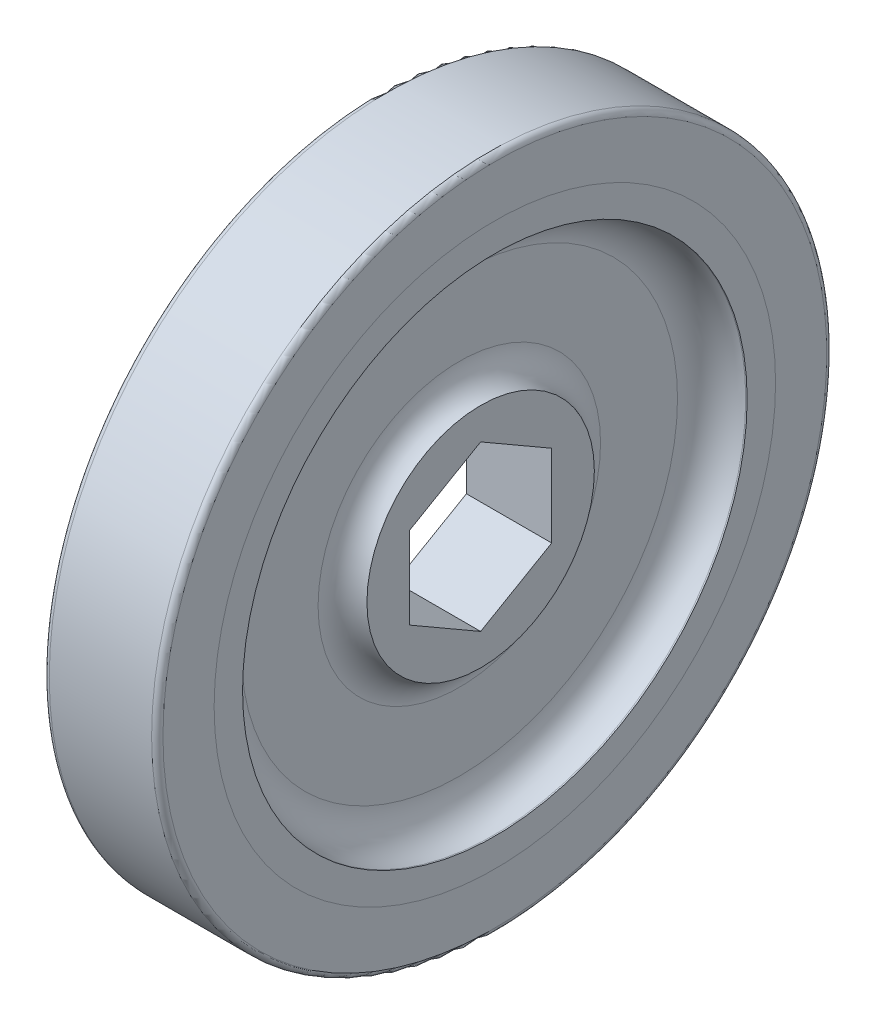
ISO-10303-21;
HEADER;
FILE_DESCRIPTION(('STEP AP214'),'2;1');
FILE_NAME('part.step','',(''),(''),'','','');
FILE_SCHEMA(('AUTOMOTIVE_DESIGN { 1 0 10303 214 1 1 1 1 }'));
ENDSEC;
DATA;
#1=APPLICATION_CONTEXT('core data for automotive mechanical design processes');
#2=APPLICATION_PROTOCOL_DEFINITION('international standard','automotive_design',2000,#1);
#3=PRODUCT_CONTEXT('',#1,'mechanical');
#4=PRODUCT('Part','Part','',(#3));
#5=PRODUCT_RELATED_PRODUCT_CATEGORY('part','',(#4));
#6=PRODUCT_DEFINITION_FORMATION('','',#4);
#7=PRODUCT_DEFINITION_CONTEXT('part definition',#1,'design');
#8=PRODUCT_DEFINITION('design','',#6,#7);
#9=PRODUCT_DEFINITION_SHAPE('','',#8);
#10=(LENGTH_UNIT() NAMED_UNIT(*) SI_UNIT(.MILLI.,.METRE.));
#11=(NAMED_UNIT(*) PLANE_ANGLE_UNIT() SI_UNIT($,.RADIAN.));
#12=(NAMED_UNIT(*) SI_UNIT($,.STERADIAN.) SOLID_ANGLE_UNIT());
#13=UNCERTAINTY_MEASURE_WITH_UNIT(LENGTH_MEASURE(1.E-05),#10,'distance_accuracy_value','');
#14=(GEOMETRIC_REPRESENTATION_CONTEXT(3) GLOBAL_UNCERTAINTY_ASSIGNED_CONTEXT((#13)) GLOBAL_UNIT_ASSIGNED_CONTEXT((#10,
#11,#12)) REPRESENTATION_CONTEXT('',''));
#15=CARTESIAN_POINT('',(0.,0.,0.));
#16=DIRECTION('',(0.,0.,1.));
#17=DIRECTION('',(1.,0.,0.));
#18=AXIS2_PLACEMENT_3D('',#15,#16,#17);
#19=CARTESIAN_POINT('',(-5.08,30.1625,0.));
#20=DIRECTION('',(1.,0.,0.));
#21=DIRECTION('',(0.,0.,-1.));
#22=AXIS2_PLACEMENT_3D('',#19,#20,#21);
#23=PLANE('',#22);
#24=CARTESIAN_POINT('',(-5.08,0.,0.));
#25=DIRECTION('',(1.,0.,0.));
#26=DIRECTION('',(0.,0.,-1.));
#27=AXIS2_PLACEMENT_3D('',#24,#25,#26);
#28=CIRCLE('',#27,29.6545);
#29=CARTESIAN_POINT('',(-5.08,0.,-29.6545));
#30=VERTEX_POINT('',#29);
#31=EDGE_CURVE('E57',#30,#30,#28,.F.);
#32=ORIENTED_EDGE('',*,*,#31,.T.);
#33=EDGE_LOOP('',(#32));
#34=FACE_BOUND('',#33,.T.);
#35=CARTESIAN_POINT('',(-5.08,0.,0.));
#36=DIRECTION('',(-1.,0.,0.));
#37=DIRECTION('',(0.,0.,1.));
#38=AXIS2_PLACEMENT_3D('',#35,#36,#37);
#39=CIRCLE('',#38,25.0825);
#40=CARTESIAN_POINT('',(-5.08,0.,25.0825));
#41=VERTEX_POINT('',#40);
#42=EDGE_CURVE('E62',#41,#41,#39,.T.);
#43=ORIENTED_EDGE('',*,*,#42,.F.);
#44=EDGE_LOOP('',(#43));
#45=FACE_BOUND('',#44,.T.);
#46=ADVANCED_FACE('F42',(#34,#45),#23,.F.);
#47=CARTESIAN_POINT('',(-3.81,0.,0.));
#48=DIRECTION('',(-1.,0.,0.));
#49=DIRECTION('',(0.,0.,1.));
#50=AXIS2_PLACEMENT_3D('',#47,#48,#49);
#51=CYLINDRICAL_SURFACE('',#50,25.0825);
#52=CARTESIAN_POINT('',(-2.54,0.,0.));
#53=DIRECTION('',(-1.,0.,0.));
#54=DIRECTION('',(0.,0.,1.));
#55=AXIS2_PLACEMENT_3D('',#52,#53,#54);
#56=CIRCLE('',#55,25.0825);
#57=CARTESIAN_POINT('',(-2.54,0.,25.0825));
#58=VERTEX_POINT('',#57);
#59=EDGE_CURVE('E65',#58,#58,#56,.T.);
#60=ORIENTED_EDGE('',*,*,#59,.F.);
#61=EDGE_LOOP('',(#60));
#62=FACE_BOUND('',#61,.T.);
#63=ORIENTED_EDGE('',*,*,#42,.T.);
#64=EDGE_LOOP('',(#63));
#65=FACE_BOUND('',#64,.T.);
#66=ADVANCED_FACE('F104',(#62,#65),#51,.F.);
#67=CARTESIAN_POINT('',(-2.54,25.0825,0.));
#68=DIRECTION('',(-1.,0.,0.));
#69=DIRECTION('',(0.,0.,1.));
#70=AXIS2_PLACEMENT_3D('',#67,#68,#69);
#71=PLANE('',#70);
#72=CARTESIAN_POINT('',(-2.54,0.,0.));
#73=DIRECTION('',(-1.,0.,0.));
#74=DIRECTION('',(0.,0.,1.));
#75=AXIS2_PLACEMENT_3D('',#72,#73,#74);
#76=CIRCLE('',#75,27.6225);
#77=CARTESIAN_POINT('',(-2.54,0.,27.6225));
#78=VERTEX_POINT('',#77);
#79=EDGE_CURVE('E68',#78,#78,#76,.T.);
#80=ORIENTED_EDGE('',*,*,#79,.F.);
#81=EDGE_LOOP('',(#80));
#82=FACE_BOUND('',#81,.T.);
#83=ORIENTED_EDGE('',*,*,#59,.T.);
#84=EDGE_LOOP('',(#83));
#85=FACE_BOUND('',#84,.T.);
#86=ADVANCED_FACE('F98',(#82,#85),#71,.F.);
#87=CARTESIAN_POINT('',(-3.81,0.,0.));
#88=DIRECTION('',(-1.,0.,0.));
#89=DIRECTION('',(0.,0.,1.));
#90=AXIS2_PLACEMENT_3D('',#87,#88,#89);
#91=CYLINDRICAL_SURFACE('',#90,27.6225);
#92=CARTESIAN_POINT('',(2.54,0.,0.));
#93=DIRECTION('',(-1.,0.,0.));
#94=DIRECTION('',(0.,0.,1.));
#95=AXIS2_PLACEMENT_3D('',#92,#93,#94);
#96=CIRCLE('',#95,27.6225);
#97=CARTESIAN_POINT('',(2.54,0.,27.6225));
#98=VERTEX_POINT('',#97);
#99=EDGE_CURVE('E71',#98,#98,#96,.T.);
#100=ORIENTED_EDGE('',*,*,#99,.F.);
#101=EDGE_LOOP('',(#100));
#102=FACE_BOUND('',#101,.T.);
#103=ORIENTED_EDGE('',*,*,#79,.T.);
#104=EDGE_LOOP('',(#103));
#105=FACE_BOUND('',#104,.T.);
#106=ADVANCED_FACE('F92',(#102,#105),#91,.F.);
#107=CARTESIAN_POINT('',(2.54,27.6225,0.));
#108=DIRECTION('',(1.,0.,0.));
#109=DIRECTION('',(0.,0.,-1.));
#110=AXIS2_PLACEMENT_3D('',#107,#108,#109);
#111=PLANE('',#110);
#112=CARTESIAN_POINT('',(2.54,0.,0.));
#113=DIRECTION('',(-1.,0.,0.));
#114=DIRECTION('',(0.,0.,1.));
#115=AXIS2_PLACEMENT_3D('',#112,#113,#114);
#116=CIRCLE('',#115,25.0825);
#117=CARTESIAN_POINT('',(2.54,0.,25.0825));
#118=VERTEX_POINT('',#117);
#119=EDGE_CURVE('E74',#118,#118,#116,.T.);
#120=ORIENTED_EDGE('',*,*,#119,.F.);
#121=EDGE_LOOP('',(#120));
#122=FACE_BOUND('',#121,.T.);
#123=ORIENTED_EDGE('',*,*,#99,.T.);
#124=EDGE_LOOP('',(#123));
#125=FACE_BOUND('',#124,.T.);
#126=ADVANCED_FACE('F86',(#122,#125),#111,.F.);
#127=CARTESIAN_POINT('',(-3.81,0.,0.));
#128=DIRECTION('',(-1.,0.,0.));
#129=DIRECTION('',(0.,0.,1.));
#130=AXIS2_PLACEMENT_3D('',#127,#128,#129);
#131=CYLINDRICAL_SURFACE('',#130,25.0825);
#132=CARTESIAN_POINT('',(5.08,0.,0.));
#133=DIRECTION('',(-1.,0.,0.));
#134=DIRECTION('',(0.,0.,1.));
#135=AXIS2_PLACEMENT_3D('',#132,#133,#134);
#136=CIRCLE('',#135,25.0825);
#137=CARTESIAN_POINT('',(5.08,0.,25.0825));
#138=VERTEX_POINT('',#137);
#139=EDGE_CURVE('E77',#138,#138,#136,.T.);
#140=ORIENTED_EDGE('',*,*,#139,.F.);
#141=EDGE_LOOP('',(#140));
#142=FACE_BOUND('',#141,.T.);
#143=ORIENTED_EDGE('',*,*,#119,.T.);
#144=EDGE_LOOP('',(#143));
#145=FACE_BOUND('',#144,.T.);
#146=ADVANCED_FACE('F83',(#142,#145),#131,.F.);
#147=CARTESIAN_POINT('',(5.08,25.0825,0.));
#148=DIRECTION('',(-1.,0.,0.));
#149=DIRECTION('',(0.,0.,1.));
#150=AXIS2_PLACEMENT_3D('',#147,#148,#149);
#151=PLANE('',#150);
#152=CARTESIAN_POINT('',(5.08,0.,0.));
#153=DIRECTION('',(-1.,0.,0.));
#154=DIRECTION('',(0.,0.,1.));
#155=AXIS2_PLACEMENT_3D('',#152,#153,#154);
#156=CIRCLE('',#155,29.6545);
#157=CARTESIAN_POINT('',(5.08,0.,29.6545));
#158=VERTEX_POINT('',#157);
#159=EDGE_CURVE('E11',#158,#158,#156,.F.);
#160=ORIENTED_EDGE('',*,*,#159,.T.);
#161=EDGE_LOOP('',(#160));
#162=FACE_BOUND('',#161,.T.);
#163=ORIENTED_EDGE('',*,*,#139,.T.);
#164=EDGE_LOOP('',(#163));
#165=FACE_BOUND('',#164,.T.);
#166=ADVANCED_FACE('F81',(#162,#165),#151,.F.);
#167=CARTESIAN_POINT('',(-3.81,0.,0.));
#168=DIRECTION('',(-1.,0.,0.));
#169=DIRECTION('',(0.,0.,1.));
#170=AXIS2_PLACEMENT_3D('',#167,#168,#169);
#171=CYLINDRICAL_SURFACE('',#170,30.1625);
#172=CARTESIAN_POINT('',(-4.572,0.,0.));
#173=DIRECTION('',(1.,0.,0.));
#174=DIRECTION('',(0.,0.,-1.));
#175=AXIS2_PLACEMENT_3D('',#172,#173,#174);
#176=CIRCLE('',#175,30.1625);
#177=CARTESIAN_POINT('',(-4.572,0.,-30.1625));
#178=VERTEX_POINT('',#177);
#179=EDGE_CURVE('E49',#178,#178,#176,.T.);
#180=ORIENTED_EDGE('',*,*,#179,.T.);
#181=EDGE_LOOP('',(#180));
#182=FACE_BOUND('',#181,.T.);
#183=CARTESIAN_POINT('',(4.572,0.,0.));
#184=DIRECTION('',(-1.,0.,0.));
#185=DIRECTION('',(0.,0.,1.));
#186=AXIS2_PLACEMENT_3D('',#183,#184,#185);
#187=CIRCLE('',#186,30.1625);
#188=CARTESIAN_POINT('',(4.572,0.,30.1625));
#189=VERTEX_POINT('',#188);
#190=EDGE_CURVE('E53',#189,#189,#187,.T.);
#191=ORIENTED_EDGE('',*,*,#190,.T.);
#192=EDGE_LOOP('',(#191));
#193=FACE_BOUND('',#192,.T.);
#194=ADVANCED_FACE('F120',(#182,#193),#171,.T.);
#195=CARTESIAN_POINT('',(-4.572,0.,0.));
#196=DIRECTION('',(1.,0.,0.));
#197=DIRECTION('',(0.,0.,-1.));
#198=AXIS2_PLACEMENT_3D('',#195,#196,#197);
#199=TOROIDAL_SURFACE('',#198,29.6545,0.508);
#200=ORIENTED_EDGE('',*,*,#179,.F.);
#201=EDGE_LOOP('',(#200));
#202=FACE_BOUND('',#201,.T.);
#203=ORIENTED_EDGE('',*,*,#31,.F.);
#204=EDGE_LOOP('',(#203));
#205=FACE_BOUND('',#204,.T.);
#206=ADVANCED_FACE('F118',(#202,#205),#199,.T.);
#207=CARTESIAN_POINT('',(4.572,0.,0.));
#208=DIRECTION('',(-1.,0.,0.));
#209=DIRECTION('',(0.,0.,1.));
#210=AXIS2_PLACEMENT_3D('',#207,#208,#209);
#211=TOROIDAL_SURFACE('',#210,29.6545,0.508);
#212=ORIENTED_EDGE('',*,*,#159,.F.);
#213=EDGE_LOOP('',(#212));
#214=FACE_BOUND('',#213,.T.);
#215=ORIENTED_EDGE('',*,*,#190,.F.);
#216=EDGE_LOOP('',(#215));
#217=FACE_BOUND('',#216,.T.);
#218=ADVANCED_FACE('F44',(#214,#217),#211,.T.);
#219=CLOSED_SHELL('',(#46,#66,#86,#106,#126,#146,#166,#194,#206,#218));
#220=MANIFOLD_SOLID_BREP('B2',#219);
#221=CARTESIAN_POINT('',(-3.81,10.16,0.));
#222=DIRECTION('',(1.,0.,0.));
#223=DIRECTION('',(0.,0.,-1.));
#224=AXIS2_PLACEMENT_3D('',#221,#222,#223);
#225=PLANE('',#224);
#226=DIRECTION('',(0.,1.,0.));
#227=VECTOR('',#226,1.);
#228=CARTESIAN_POINT('',(-3.81,10.16,-6.35));
#229=LINE('',#228,#227);
#230=CARTESIAN_POINT('',(-3.81,-3.66617420935412,-6.35));
#231=VERTEX_POINT('',#230);
#232=CARTESIAN_POINT('',(-3.81,3.66617420935413,-6.35));
#233=VERTEX_POINT('',#232);
#234=EDGE_CURVE('E300',#231,#233,#229,.T.);
#235=ORIENTED_EDGE('',*,*,#234,.T.);
#236=DIRECTION('',(0.,0.5,0.866025403784439));
#237=VECTOR('',#236,1.);
#238=CARTESIAN_POINT('',(-3.81,8.03926131403119,1.22440905122495));
#239=LINE('',#238,#237);
#240=CARTESIAN_POINT('',(-3.81,7.33234841870825,0.));
#241=VERTEX_POINT('',#240);
#242=EDGE_CURVE('E282',#233,#241,#239,.T.);
#243=ORIENTED_EDGE('',*,*,#242,.T.);
#244=DIRECTION('',(0.,-0.5,0.866025403784439));
#245=VECTOR('',#244,1.);
#246=CARTESIAN_POINT('',(-3.81,8.03926131403119,-1.22440905122495));
#247=LINE('',#246,#245);
#248=CARTESIAN_POINT('',(-3.81,3.66617420935413,6.35));
#249=VERTEX_POINT('',#248);
#250=EDGE_CURVE('E283',#241,#249,#247,.T.);
#251=ORIENTED_EDGE('',*,*,#250,.T.);
#252=DIRECTION('',(0.,-1.,0.));
#253=VECTOR('',#252,1.);
#254=CARTESIAN_POINT('',(-3.81,10.16,6.35));
#255=LINE('',#254,#253);
#256=CARTESIAN_POINT('',(-3.81,-3.66617420935412,6.35));
#257=VERTEX_POINT('',#256);
#258=EDGE_CURVE('E255',#249,#257,#255,.T.);
#259=ORIENTED_EDGE('',*,*,#258,.T.);
#260=DIRECTION('',(0.,-0.5,-0.866025403784439));
#261=VECTOR('',#260,1.);
#262=CARTESIAN_POINT('',(-3.81,-2.95926131403118,7.57440905122495));
#263=LINE('',#262,#261);
#264=CARTESIAN_POINT('',(-3.81,-7.33234841870825,0.));
#265=VERTEX_POINT('',#264);
#266=EDGE_CURVE('E294',#257,#265,#263,.T.);
#267=ORIENTED_EDGE('',*,*,#266,.T.);
#268=DIRECTION('',(0.,0.5,-0.866025403784439));
#269=VECTOR('',#268,1.);
#270=CARTESIAN_POINT('',(-3.81,-2.95926131403119,-7.57440905122495));
#271=LINE('',#270,#269);
#272=EDGE_CURVE('E297',#265,#231,#271,.T.);
#273=ORIENTED_EDGE('',*,*,#272,.T.);
#274=EDGE_LOOP('',(#235,#243,#251,#259,#267,#273));
#275=FACE_BOUND('',#274,.T.);
#276=CARTESIAN_POINT('',(-3.81,0.,0.));
#277=DIRECTION('',(-1.,0.,0.));
#278=DIRECTION('',(0.,0.,1.));
#279=AXIS2_PLACEMENT_3D('',#276,#277,#278);
#280=CIRCLE('',#279,10.16);
#281=CARTESIAN_POINT('',(-3.81,0.,10.16));
#282=VERTEX_POINT('',#281);
#283=EDGE_CURVE('E330',#282,#282,#280,.T.);
#284=ORIENTED_EDGE('',*,*,#283,.T.);
#285=EDGE_LOOP('',(#284));
#286=FACE_BOUND('',#285,.T.);
#287=ADVANCED_FACE('F193',(#275,#286),#225,.F.);
#288=CARTESIAN_POINT('',(3.81,10.16,0.));
#289=DIRECTION('',(-1.,0.,0.));
#290=DIRECTION('',(0.,0.,1.));
#291=AXIS2_PLACEMENT_3D('',#288,#289,#290);
#292=PLANE('',#291);
#293=DIRECTION('',(0.,0.5,-0.866025403784439));
#294=VECTOR('',#293,1.);
#295=CARTESIAN_POINT('',(3.81,8.03926131403119,-1.22440905122495));
#296=LINE('',#295,#294);
#297=CARTESIAN_POINT('',(3.81,3.66617420935413,6.35));
#298=VERTEX_POINT('',#297);
#299=CARTESIAN_POINT('',(3.81,7.33234841870825,0.));
#300=VERTEX_POINT('',#299);
#301=EDGE_CURVE('E243',#298,#300,#296,.T.);
#302=ORIENTED_EDGE('',*,*,#301,.T.);
#303=DIRECTION('',(0.,-0.5,-0.866025403784439));
#304=VECTOR('',#303,1.);
#305=CARTESIAN_POINT('',(3.81,8.03926131403119,1.22440905122495));
#306=LINE('',#305,#304);
#307=CARTESIAN_POINT('',(3.81,3.66617420935413,-6.35));
#308=VERTEX_POINT('',#307);
#309=EDGE_CURVE('E40',#300,#308,#306,.T.);
#310=ORIENTED_EDGE('',*,*,#309,.T.);
#311=DIRECTION('',(0.,-1.,0.));
#312=VECTOR('',#311,1.);
#313=CARTESIAN_POINT('',(3.81,10.16,-6.35));
#314=LINE('',#313,#312);
#315=CARTESIAN_POINT('',(3.81,-3.66617420935412,-6.35));
#316=VERTEX_POINT('',#315);
#317=EDGE_CURVE('E201',#308,#316,#314,.T.);
#318=ORIENTED_EDGE('',*,*,#317,.T.);
#319=DIRECTION('',(0.,-0.5,0.866025403784439));
#320=VECTOR('',#319,1.);
#321=CARTESIAN_POINT('',(3.81,-2.95926131403119,-7.57440905122495));
#322=LINE('',#321,#320);
#323=CARTESIAN_POINT('',(3.81,-7.33234841870825,0.));
#324=VERTEX_POINT('',#323);
#325=EDGE_CURVE('E265',#316,#324,#322,.T.);
#326=ORIENTED_EDGE('',*,*,#325,.T.);
#327=DIRECTION('',(0.,0.5,0.866025403784439));
#328=VECTOR('',#327,1.);
#329=CARTESIAN_POINT('',(3.81,-2.95926131403118,7.57440905122495));
#330=LINE('',#329,#328);
#331=CARTESIAN_POINT('',(3.81,-3.66617420935412,6.35));
#332=VERTEX_POINT('',#331);
#333=EDGE_CURVE('E263',#324,#332,#330,.T.);
#334=ORIENTED_EDGE('',*,*,#333,.T.);
#335=DIRECTION('',(0.,1.,0.));
#336=VECTOR('',#335,1.);
#337=CARTESIAN_POINT('',(3.81,10.16,6.35));
#338=LINE('',#337,#336);
#339=EDGE_CURVE('E247',#332,#298,#338,.T.);
#340=ORIENTED_EDGE('',*,*,#339,.T.);
#341=EDGE_LOOP('',(#302,#310,#318,#326,#334,#340));
#342=FACE_BOUND('',#341,.T.);
#343=CARTESIAN_POINT('',(3.81,0.,0.));
#344=DIRECTION('',(-1.,0.,0.));
#345=DIRECTION('',(0.,0.,1.));
#346=AXIS2_PLACEMENT_3D('',#343,#344,#345);
#347=CIRCLE('',#346,10.16);
#348=CARTESIAN_POINT('',(3.81,0.,10.16));
#349=VERTEX_POINT('',#348);
#350=EDGE_CURVE('E327',#349,#349,#347,.T.);
#351=ORIENTED_EDGE('',*,*,#350,.F.);
#352=EDGE_LOOP('',(#351));
#353=FACE_BOUND('',#352,.T.);
#354=ADVANCED_FACE('F260',(#342,#353),#292,.F.);
#355=CARTESIAN_POINT('',(1.905,22.5425,0.));
#356=DIRECTION('',(-1.,0.,0.));
#357=DIRECTION('',(0.,0.,1.));
#358=AXIS2_PLACEMENT_3D('',#355,#356,#357);
#359=PLANE('',#358);
#360=CARTESIAN_POINT('',(1.905,0.,0.));
#361=DIRECTION('',(-1.,0.,0.));
#362=DIRECTION('',(0.,0.,1.));
#363=AXIS2_PLACEMENT_3D('',#360,#361,#362);
#364=CIRCLE('',#363,19.4945);
#365=CARTESIAN_POINT('',(1.905,0.,19.4945));
#366=VERTEX_POINT('',#365);
#367=EDGE_CURVE('E342',#366,#366,#364,.F.);
#368=ORIENTED_EDGE('',*,*,#367,.T.);
#369=EDGE_LOOP('',(#368));
#370=FACE_BOUND('',#369,.T.);
#371=CARTESIAN_POINT('',(1.905,0.,0.));
#372=DIRECTION('',(-1.,0.,0.));
#373=DIRECTION('',(0.,0.,1.));
#374=AXIS2_PLACEMENT_3D('',#371,#372,#373);
#375=CIRCLE('',#374,12.6193444248417);
#376=CARTESIAN_POINT('',(1.905,0.,12.6193444248417));
#377=VERTEX_POINT('',#376);
#378=EDGE_CURVE('E336',#377,#377,#375,.T.);
#379=ORIENTED_EDGE('',*,*,#378,.T.);
#380=EDGE_LOOP('',(#379));
#381=FACE_BOUND('',#380,.T.);
#382=ADVANCED_FACE('F377',(#370,#381),#359,.F.);
#383=CARTESIAN_POINT('',(-3.81,0.,0.));
#384=DIRECTION('',(-1.,0.,0.));
#385=DIRECTION('',(0.,0.,1.));
#386=AXIS2_PLACEMENT_3D('',#383,#384,#385);
#387=CYLINDRICAL_SURFACE('',#386,22.5425);
#388=CARTESIAN_POINT('',(4.953,0.,0.));
#389=DIRECTION('',(-1.,0.,0.));
#390=DIRECTION('',(0.,0.,1.));
#391=AXIS2_PLACEMENT_3D('',#388,#389,#390);
#392=CIRCLE('',#391,22.5425);
#393=CARTESIAN_POINT('',(4.953,0.,22.5425));
#394=VERTEX_POINT('',#393);
#395=EDGE_CURVE('E339',#394,#394,#392,.T.);
#396=ORIENTED_EDGE('',*,*,#395,.T.);
#397=EDGE_LOOP('',(#396));
#398=FACE_BOUND('',#397,.T.);
#399=CARTESIAN_POINT('',(5.08,0.,0.));
#400=DIRECTION('',(-1.,0.,0.));
#401=DIRECTION('',(0.,0.,1.));
#402=AXIS2_PLACEMENT_3D('',#399,#400,#401);
#403=CIRCLE('',#402,22.5425);
#404=CARTESIAN_POINT('',(5.08,0.,22.5425));
#405=VERTEX_POINT('',#404);
#406=EDGE_CURVE('E324',#405,#405,#403,.T.);
#407=ORIENTED_EDGE('',*,*,#406,.F.);
#408=EDGE_LOOP('',(#407));
#409=FACE_BOUND('',#408,.T.);
#410=ADVANCED_FACE('F391',(#398,#409),#387,.F.);
#411=CARTESIAN_POINT('',(5.08,25.0825,0.));
#412=DIRECTION('',(-1.,0.,0.));
#413=DIRECTION('',(0.,0.,1.));
#414=AXIS2_PLACEMENT_3D('',#411,#412,#413);
#415=PLANE('',#414);
#416=CARTESIAN_POINT('',(5.08,0.,0.));
#417=DIRECTION('',(-1.,0.,0.));
#418=DIRECTION('',(0.,0.,1.));
#419=AXIS2_PLACEMENT_3D('',#416,#417,#418);
#420=CIRCLE('',#419,25.0825);
#421=CARTESIAN_POINT('',(5.08,0.,25.0825));
#422=VERTEX_POINT('',#421);
#423=EDGE_CURVE('E321',#422,#422,#420,.T.);
#424=ORIENTED_EDGE('',*,*,#423,.F.);
#425=EDGE_LOOP('',(#424));
#426=FACE_BOUND('',#425,.T.);
#427=ORIENTED_EDGE('',*,*,#406,.T.);
#428=EDGE_LOOP('',(#427));
#429=FACE_BOUND('',#428,.T.);
#430=ADVANCED_FACE('F394',(#426,#429),#415,.F.);
#431=CARTESIAN_POINT('',(-3.81,0.,0.));
#432=DIRECTION('',(-1.,0.,0.));
#433=DIRECTION('',(0.,0.,1.));
#434=AXIS2_PLACEMENT_3D('',#431,#432,#433);
#435=CYLINDRICAL_SURFACE('',#434,25.0825);
#436=CARTESIAN_POINT('',(2.54,0.,0.));
#437=DIRECTION('',(-1.,0.,0.));
#438=DIRECTION('',(0.,0.,1.));
#439=AXIS2_PLACEMENT_3D('',#436,#437,#438);
#440=CIRCLE('',#439,25.0825);
#441=CARTESIAN_POINT('',(2.54,0.,25.0825));
#442=VERTEX_POINT('',#441);
#443=EDGE_CURVE('E318',#442,#442,#440,.T.);
#444=ORIENTED_EDGE('',*,*,#443,.F.);
#445=EDGE_LOOP('',(#444));
#446=FACE_BOUND('',#445,.T.);
#447=ORIENTED_EDGE('',*,*,#423,.T.);
#448=EDGE_LOOP('',(#447));
#449=FACE_BOUND('',#448,.T.);
#450=ADVANCED_FACE('F399',(#446,#449),#435,.T.);
#451=CARTESIAN_POINT('',(2.54,27.6225,0.));
#452=DIRECTION('',(-1.,0.,0.));
#453=DIRECTION('',(0.,0.,1.));
#454=AXIS2_PLACEMENT_3D('',#451,#452,#453);
#455=PLANE('',#454);
#456=CARTESIAN_POINT('',(2.54,0.,0.));
#457=DIRECTION('',(-1.,0.,0.));
#458=DIRECTION('',(0.,0.,1.));
#459=AXIS2_PLACEMENT_3D('',#456,#457,#458);
#460=CIRCLE('',#459,27.6225);
#461=CARTESIAN_POINT('',(2.54,0.,27.6225));
#462=VERTEX_POINT('',#461);
#463=EDGE_CURVE('E315',#462,#462,#460,.T.);
#464=ORIENTED_EDGE('',*,*,#463,.F.);
#465=EDGE_LOOP('',(#464));
#466=FACE_BOUND('',#465,.T.);
#467=ORIENTED_EDGE('',*,*,#443,.T.);
#468=EDGE_LOOP('',(#467));
#469=FACE_BOUND('',#468,.T.);
#470=ADVANCED_FACE('F405',(#466,#469),#455,.F.);
#471=CARTESIAN_POINT('',(-3.81,0.,0.));
#472=DIRECTION('',(-1.,0.,0.));
#473=DIRECTION('',(0.,0.,1.));
#474=AXIS2_PLACEMENT_3D('',#471,#472,#473);
#475=CYLINDRICAL_SURFACE('',#474,27.6225);
#476=CARTESIAN_POINT('',(-2.54,0.,0.));
#477=DIRECTION('',(-1.,0.,0.));
#478=DIRECTION('',(0.,0.,1.));
#479=AXIS2_PLACEMENT_3D('',#476,#477,#478);
#480=CIRCLE('',#479,27.6225);
#481=CARTESIAN_POINT('',(-2.54,0.,27.6225));
#482=VERTEX_POINT('',#481);
#483=EDGE_CURVE('E312',#482,#482,#480,.T.);
#484=ORIENTED_EDGE('',*,*,#483,.F.);
#485=EDGE_LOOP('',(#484));
#486=FACE_BOUND('',#485,.T.);
#487=ORIENTED_EDGE('',*,*,#463,.T.);
#488=EDGE_LOOP('',(#487));
#489=FACE_BOUND('',#488,.T.);
#490=ADVANCED_FACE('F528',(#486,#489),#475,.T.);
#491=CARTESIAN_POINT('',(-2.54,27.6225,0.));
#492=DIRECTION('',(1.,0.,0.));
#493=DIRECTION('',(0.,0.,-1.));
#494=AXIS2_PLACEMENT_3D('',#491,#492,#493);
#495=PLANE('',#494);
#496=CARTESIAN_POINT('',(-2.54,0.,0.));
#497=DIRECTION('',(-1.,0.,0.));
#498=DIRECTION('',(0.,0.,1.));
#499=AXIS2_PLACEMENT_3D('',#496,#497,#498);
#500=CIRCLE('',#499,25.0825);
#501=CARTESIAN_POINT('',(-2.54,0.,25.0825));
#502=VERTEX_POINT('',#501);
#503=EDGE_CURVE('E309',#502,#502,#500,.T.);
#504=ORIENTED_EDGE('',*,*,#503,.F.);
#505=EDGE_LOOP('',(#504));
#506=FACE_BOUND('',#505,.T.);
#507=ORIENTED_EDGE('',*,*,#483,.T.);
#508=EDGE_LOOP('',(#507));
#509=FACE_BOUND('',#508,.T.);
#510=ADVANCED_FACE('F524',(#506,#509),#495,.F.);
#511=CARTESIAN_POINT('',(-3.81,0.,0.));
#512=DIRECTION('',(-1.,0.,0.));
#513=DIRECTION('',(0.,0.,1.));
#514=AXIS2_PLACEMENT_3D('',#511,#512,#513);
#515=CYLINDRICAL_SURFACE('',#514,25.0825);
#516=CARTESIAN_POINT('',(-5.08,0.,0.));
#517=DIRECTION('',(-1.,0.,0.));
#518=DIRECTION('',(0.,0.,1.));
#519=AXIS2_PLACEMENT_3D('',#516,#517,#518);
#520=CIRCLE('',#519,25.0825);
#521=CARTESIAN_POINT('',(-5.08,0.,25.0825));
#522=VERTEX_POINT('',#521);
#523=EDGE_CURVE('E306',#522,#522,#520,.T.);
#524=ORIENTED_EDGE('',*,*,#523,.F.);
#525=EDGE_LOOP('',(#524));
#526=FACE_BOUND('',#525,.T.);
#527=ORIENTED_EDGE('',*,*,#503,.T.);
#528=EDGE_LOOP('',(#527));
#529=FACE_BOUND('',#528,.T.);
#530=ADVANCED_FACE('F520',(#526,#529),#515,.T.);
#531=CARTESIAN_POINT('',(-5.08,25.0825,0.));
#532=DIRECTION('',(1.,0.,0.));
#533=DIRECTION('',(0.,0.,-1.));
#534=AXIS2_PLACEMENT_3D('',#531,#532,#533);
#535=PLANE('',#534);
#536=CARTESIAN_POINT('',(-5.08,0.,0.));
#537=DIRECTION('',(-1.,0.,0.));
#538=DIRECTION('',(0.,0.,1.));
#539=AXIS2_PLACEMENT_3D('',#536,#537,#538);
#540=CIRCLE('',#539,22.5425);
#541=CARTESIAN_POINT('',(-5.08,0.,22.5425));
#542=VERTEX_POINT('',#541);
#543=EDGE_CURVE('E303',#542,#542,#540,.T.);
#544=ORIENTED_EDGE('',*,*,#543,.F.);
#545=EDGE_LOOP('',(#544));
#546=FACE_BOUND('',#545,.T.);
#547=ORIENTED_EDGE('',*,*,#523,.T.);
#548=EDGE_LOOP('',(#547));
#549=FACE_BOUND('',#548,.T.);
#550=ADVANCED_FACE('F434',(#546,#549),#535,.F.);
#551=CARTESIAN_POINT('',(-3.81,0.,0.));
#552=DIRECTION('',(-1.,0.,0.));
#553=DIRECTION('',(0.,0.,1.));
#554=AXIS2_PLACEMENT_3D('',#551,#552,#553);
#555=CYLINDRICAL_SURFACE('',#554,22.5425);
#556=CARTESIAN_POINT('',(-4.953,0.,0.));
#557=DIRECTION('',(1.,0.,0.));
#558=DIRECTION('',(0.,0.,-1.));
#559=AXIS2_PLACEMENT_3D('',#556,#557,#558);
#560=CIRCLE('',#559,22.5425);
#561=CARTESIAN_POINT('',(-4.953,0.,-22.5425));
#562=VERTEX_POINT('',#561);
#563=EDGE_CURVE('E248',#562,#562,#560,.T.);
#564=ORIENTED_EDGE('',*,*,#563,.T.);
#565=EDGE_LOOP('',(#564));
#566=FACE_BOUND('',#565,.T.);
#567=ORIENTED_EDGE('',*,*,#543,.T.);
#568=EDGE_LOOP('',(#567));
#569=FACE_BOUND('',#568,.T.);
#570=ADVANCED_FACE('F350',(#566,#569),#555,.F.);
#571=CARTESIAN_POINT('',(-1.905,22.5425,0.));
#572=DIRECTION('',(1.,0.,0.));
#573=DIRECTION('',(0.,0.,-1.));
#574=AXIS2_PLACEMENT_3D('',#571,#572,#573);
#575=PLANE('',#574);
#576=CARTESIAN_POINT('',(-1.905,0.,0.));
#577=DIRECTION('',(1.,0.,0.));
#578=DIRECTION('',(0.,0.,-1.));
#579=AXIS2_PLACEMENT_3D('',#576,#577,#578);
#580=CIRCLE('',#579,19.4945);
#581=CARTESIAN_POINT('',(-1.905,0.,-19.4945));
#582=VERTEX_POINT('',#581);
#583=EDGE_CURVE('E345',#582,#582,#580,.F.);
#584=ORIENTED_EDGE('',*,*,#583,.T.);
#585=EDGE_LOOP('',(#584));
#586=FACE_BOUND('',#585,.T.);
#587=CARTESIAN_POINT('',(-1.905,0.,0.));
#588=DIRECTION('',(1.,0.,0.));
#589=DIRECTION('',(0.,0.,-1.));
#590=AXIS2_PLACEMENT_3D('',#587,#588,#589);
#591=CIRCLE('',#590,12.6193444248417);
#592=CARTESIAN_POINT('',(-1.905,0.,-12.6193444248417));
#593=VERTEX_POINT('',#592);
#594=EDGE_CURVE('E333',#593,#593,#591,.T.);
#595=ORIENTED_EDGE('',*,*,#594,.T.);
#596=EDGE_LOOP('',(#595));
#597=FACE_BOUND('',#596,.T.);
#598=ADVANCED_FACE('F358',(#586,#597),#575,.F.);
#599=CARTESIAN_POINT('',(-4.445,0.,0.));
#600=DIRECTION('',(1.,0.,0.));
#601=DIRECTION('',(0.,0.,-1.));
#602=AXIS2_PLACEMENT_3D('',#599,#600,#601);
#603=TOROIDAL_SURFACE('',#602,12.6193444248417,2.54);
#604=ORIENTED_EDGE('',*,*,#594,.F.);
#605=EDGE_LOOP('',(#604));
#606=FACE_BOUND('',#605,.T.);
#607=ORIENTED_EDGE('',*,*,#283,.F.);
#608=EDGE_LOOP('',(#607));
#609=FACE_BOUND('',#608,.T.);
#610=ADVANCED_FACE('F361',(#606,#609),#603,.F.);
#611=CARTESIAN_POINT('',(4.445,0.,0.));
#612=DIRECTION('',(-1.,0.,0.));
#613=DIRECTION('',(0.,0.,1.));
#614=AXIS2_PLACEMENT_3D('',#611,#612,#613);
#615=TOROIDAL_SURFACE('',#614,12.6193444248417,2.54);
#616=ORIENTED_EDGE('',*,*,#350,.T.);
#617=EDGE_LOOP('',(#616));
#618=FACE_BOUND('',#617,.T.);
#619=ORIENTED_EDGE('',*,*,#378,.F.);
#620=EDGE_LOOP('',(#619));
#621=FACE_BOUND('',#620,.T.);
#622=ADVANCED_FACE('F367',(#618,#621),#615,.F.);
#623=CARTESIAN_POINT('',(4.953,0.,0.));
#624=DIRECTION('',(-1.,0.,0.));
#625=DIRECTION('',(0.,0.,1.));
#626=AXIS2_PLACEMENT_3D('',#623,#624,#625);
#627=TOROIDAL_SURFACE('',#626,19.4945,3.048);
#628=ORIENTED_EDGE('',*,*,#367,.F.);
#629=EDGE_LOOP('',(#628));
#630=FACE_BOUND('',#629,.T.);
#631=ORIENTED_EDGE('',*,*,#395,.F.);
#632=EDGE_LOOP('',(#631));
#633=FACE_BOUND('',#632,.T.);
#634=ADVANCED_FACE('F355',(#630,#633),#627,.F.);
#635=CARTESIAN_POINT('',(-4.953,0.,0.));
#636=DIRECTION('',(1.,0.,0.));
#637=DIRECTION('',(0.,0.,-1.));
#638=AXIS2_PLACEMENT_3D('',#635,#636,#637);
#639=TOROIDAL_SURFACE('',#638,19.4945,3.048);
#640=ORIENTED_EDGE('',*,*,#563,.F.);
#641=EDGE_LOOP('',(#640));
#642=FACE_BOUND('',#641,.T.);
#643=ORIENTED_EDGE('',*,*,#583,.F.);
#644=EDGE_LOOP('',(#643));
#645=FACE_BOUND('',#644,.T.);
#646=ADVANCED_FACE('F195',(#642,#645),#639,.F.);
#647=CARTESIAN_POINT('',(-5.08,3.66617420935413,-6.35));
#648=DIRECTION('',(0.,0.866025403784439,-0.5));
#649=DIRECTION('',(0.,0.5,0.866025403784439));
#650=AXIS2_PLACEMENT_3D('',#647,#648,#649);
#651=PLANE('',#650);
#652=DIRECTION('',(1.,0.,0.));
#653=VECTOR('',#652,1.);
#654=CARTESIAN_POINT('',(-5.08,3.66617420935413,-6.35));
#655=LINE('',#654,#653);
#656=EDGE_CURVE('E275',#233,#308,#655,.T.);
#657=ORIENTED_EDGE('',*,*,#656,.T.);
#658=ORIENTED_EDGE('',*,*,#309,.F.);
#659=DIRECTION('',(1.,0.,0.));
#660=VECTOR('',#659,1.);
#661=CARTESIAN_POINT('',(-5.08,7.33234841870825,0.));
#662=LINE('',#661,#660);
#663=EDGE_CURVE('E213',#241,#300,#662,.T.);
#664=ORIENTED_EDGE('',*,*,#663,.F.);
#665=ORIENTED_EDGE('',*,*,#242,.F.);
#666=EDGE_LOOP('',(#657,#658,#664,#665));
#667=FACE_BOUND('',#666,.T.);
#668=ADVANCED_FACE('F280',(#667),#651,.F.);
#669=CARTESIAN_POINT('',(-5.08,-3.66617420935412,-6.35));
#670=DIRECTION('',(0.,0.,-1.));
#671=DIRECTION('',(0.,1.,0.));
#672=AXIS2_PLACEMENT_3D('',#669,#670,#671);
#673=PLANE('',#672);
#674=DIRECTION('',(1.,0.,0.));
#675=VECTOR('',#674,1.);
#676=CARTESIAN_POINT('',(-5.08,-3.66617420935412,-6.35));
#677=LINE('',#676,#675);
#678=EDGE_CURVE('E278',#231,#316,#677,.T.);
#679=ORIENTED_EDGE('',*,*,#678,.T.);
#680=ORIENTED_EDGE('',*,*,#317,.F.);
#681=ORIENTED_EDGE('',*,*,#656,.F.);
#682=ORIENTED_EDGE('',*,*,#234,.F.);
#683=EDGE_LOOP('',(#679,#680,#681,#682));
#684=FACE_BOUND('',#683,.T.);
#685=ADVANCED_FACE('F274',(#684),#673,.F.);
#686=CARTESIAN_POINT('',(-5.08,-7.33234841870825,0.));
#687=DIRECTION('',(0.,-0.866025403784439,-0.5));
#688=DIRECTION('',(0.,0.5,-0.866025403784439));
#689=AXIS2_PLACEMENT_3D('',#686,#687,#688);
#690=PLANE('',#689);
#691=DIRECTION('',(1.,0.,0.));
#692=VECTOR('',#691,1.);
#693=CARTESIAN_POINT('',(-5.08,-7.33234841870825,0.));
#694=LINE('',#693,#692);
#695=EDGE_CURVE('E286',#265,#324,#694,.T.);
#696=ORIENTED_EDGE('',*,*,#695,.T.);
#697=ORIENTED_EDGE('',*,*,#325,.F.);
#698=ORIENTED_EDGE('',*,*,#678,.F.);
#699=ORIENTED_EDGE('',*,*,#272,.F.);
#700=EDGE_LOOP('',(#696,#697,#698,#699));
#701=FACE_BOUND('',#700,.T.);
#702=ADVANCED_FACE('F479',(#701),#690,.F.);
#703=CARTESIAN_POINT('',(-5.08,-3.66617420935412,6.35));
#704=DIRECTION('',(0.,-0.866025403784439,0.5));
#705=DIRECTION('',(0.,-0.5,-0.866025403784439));
#706=AXIS2_PLACEMENT_3D('',#703,#704,#705);
#707=PLANE('',#706);
#708=DIRECTION('',(1.,0.,0.));
#709=VECTOR('',#708,1.);
#710=CARTESIAN_POINT('',(-5.08,-3.66617420935412,6.35));
#711=LINE('',#710,#709);
#712=EDGE_CURVE('E257',#257,#332,#711,.T.);
#713=ORIENTED_EDGE('',*,*,#712,.T.);
#714=ORIENTED_EDGE('',*,*,#333,.F.);
#715=ORIENTED_EDGE('',*,*,#695,.F.);
#716=ORIENTED_EDGE('',*,*,#266,.F.);
#717=EDGE_LOOP('',(#713,#714,#715,#716));
#718=FACE_BOUND('',#717,.T.);
#719=ADVANCED_FACE('F488',(#718),#707,.F.);
#720=CARTESIAN_POINT('',(-5.08,3.66617420935413,6.35));
#721=DIRECTION('',(0.,0.,1.));
#722=DIRECTION('',(1.,0.,0.));
#723=AXIS2_PLACEMENT_3D('',#720,#721,#722);
#724=PLANE('',#723);
#725=DIRECTION('',(1.,0.,0.));
#726=VECTOR('',#725,1.);
#727=CARTESIAN_POINT('',(-5.08,3.66617420935413,6.35));
#728=LINE('',#727,#726);
#729=EDGE_CURVE('E208',#249,#298,#728,.T.);
#730=ORIENTED_EDGE('',*,*,#729,.T.);
#731=ORIENTED_EDGE('',*,*,#339,.F.);
#732=ORIENTED_EDGE('',*,*,#712,.F.);
#733=ORIENTED_EDGE('',*,*,#258,.F.);
#734=EDGE_LOOP('',(#730,#731,#732,#733));
#735=FACE_BOUND('',#734,.T.);
#736=ADVANCED_FACE('F251',(#735),#724,.F.);
#737=CARTESIAN_POINT('',(-5.08,7.33234841870825,0.));
#738=DIRECTION('',(0.,0.866025403784439,0.5));
#739=DIRECTION('',(0.,-0.5,0.866025403784439));
#740=AXIS2_PLACEMENT_3D('',#737,#738,#739);
#741=PLANE('',#740);
#742=ORIENTED_EDGE('',*,*,#663,.T.);
#743=ORIENTED_EDGE('',*,*,#301,.F.);
#744=ORIENTED_EDGE('',*,*,#729,.F.);
#745=ORIENTED_EDGE('',*,*,#250,.F.);
#746=EDGE_LOOP('',(#742,#743,#744,#745));
#747=FACE_BOUND('',#746,.T.);
#748=ADVANCED_FACE('F244',(#747),#741,.F.);
#749=CLOSED_SHELL('',(#287,#354,#382,#410,#430,#450,#470,#490,#510,#530,#550,#570,#598,#610,
#622,#634,#646,#668,#685,#702,#719,#736,#748));
#750=MANIFOLD_SOLID_BREP('B6',#749);
#751=ADVANCED_BREP_SHAPE_REPRESENTATION('',(#18,#220,#750),#14);
#752=SHAPE_DEFINITION_REPRESENTATION(#9,#751);
ENDSEC;
END-ISO-10303-21;
